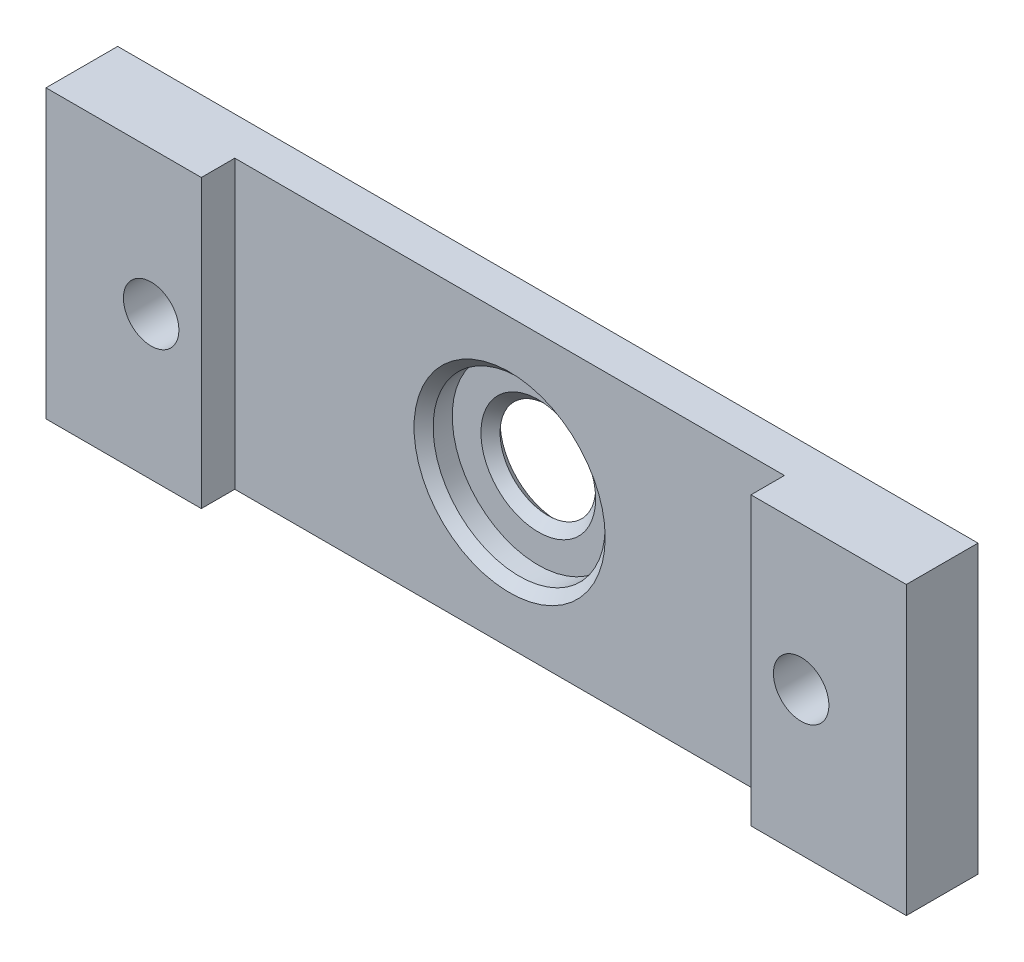
ISO-10303-21;
HEADER;
FILE_DESCRIPTION(('STEP AP214'),'2;1');
FILE_NAME('part.step','',(''),(''),'','','');
FILE_SCHEMA(('AUTOMOTIVE_DESIGN { 1 0 10303 214 1 1 1 1 }'));
ENDSEC;
DATA;
#1=APPLICATION_CONTEXT('core data for automotive mechanical design processes');
#2=APPLICATION_PROTOCOL_DEFINITION('international standard','automotive_design',2000,#1);
#3=PRODUCT_CONTEXT('',#1,'mechanical');
#4=PRODUCT('Part','Part','',(#3));
#5=PRODUCT_RELATED_PRODUCT_CATEGORY('part','',(#4));
#6=PRODUCT_DEFINITION_FORMATION('','',#4);
#7=PRODUCT_DEFINITION_CONTEXT('part definition',#1,'design');
#8=PRODUCT_DEFINITION('design','',#6,#7);
#9=PRODUCT_DEFINITION_SHAPE('','',#8);
#10=(LENGTH_UNIT() NAMED_UNIT(*) SI_UNIT(.MILLI.,.METRE.));
#11=(NAMED_UNIT(*) PLANE_ANGLE_UNIT() SI_UNIT($,.RADIAN.));
#12=(NAMED_UNIT(*) SI_UNIT($,.STERADIAN.) SOLID_ANGLE_UNIT());
#13=UNCERTAINTY_MEASURE_WITH_UNIT(LENGTH_MEASURE(1.E-05),#10,'distance_accuracy_value','');
#14=(GEOMETRIC_REPRESENTATION_CONTEXT(3) GLOBAL_UNCERTAINTY_ASSIGNED_CONTEXT((#13)) GLOBAL_UNIT_ASSIGNED_CONTEXT((#10,
#11,#12)) REPRESENTATION_CONTEXT('',''));
#15=CARTESIAN_POINT('',(0.,0.,0.));
#16=DIRECTION('',(0.,0.,1.));
#17=DIRECTION('',(1.,0.,0.));
#18=AXIS2_PLACEMENT_3D('',#15,#16,#17);
#19=CARTESIAN_POINT('',(-45.,15.,5.));
#20=DIRECTION('',(1.,0.,0.));
#21=DIRECTION('',(0.,1.,0.));
#22=AXIS2_PLACEMENT_3D('',#19,#20,#21);
#23=PLANE('',#22);
#24=DIRECTION('',(0.,0.,-1.));
#25=VECTOR('',#24,1.);
#26=CARTESIAN_POINT('',(-45.,15.,5.));
#27=LINE('',#26,#25);
#28=CARTESIAN_POINT('',(-45.,15.,8.5));
#29=VERTEX_POINT('',#28);
#30=CARTESIAN_POINT('',(-45.,15.,0.999999999999987));
#31=VERTEX_POINT('',#30);
#32=EDGE_CURVE('E135',#29,#31,#27,.T.);
#33=ORIENTED_EDGE('',*,*,#32,.T.);
#34=DIRECTION('',(0.,-1.,0.));
#35=VECTOR('',#34,1.);
#36=CARTESIAN_POINT('',(-45.,15.,0.999999999999987));
#37=LINE('',#36,#35);
#38=CARTESIAN_POINT('',(-45.,-15.,0.999999999999987));
#39=VERTEX_POINT('',#38);
#40=EDGE_CURVE('E213',#31,#39,#37,.T.);
#41=ORIENTED_EDGE('',*,*,#40,.T.);
#42=DIRECTION('',(0.,0.,-1.));
#43=VECTOR('',#42,1.);
#44=CARTESIAN_POINT('',(-45.,-15.,5.));
#45=LINE('',#44,#43);
#46=CARTESIAN_POINT('',(-45.,-15.,8.5));
#47=VERTEX_POINT('',#46);
#48=EDGE_CURVE('E210',#47,#39,#45,.T.);
#49=ORIENTED_EDGE('',*,*,#48,.F.);
#50=DIRECTION('',(0.,-1.,0.));
#51=VECTOR('',#50,1.);
#52=CARTESIAN_POINT('',(-45.,-15.,8.5));
#53=LINE('',#52,#51);
#54=EDGE_CURVE('E187',#29,#47,#53,.T.);
#55=ORIENTED_EDGE('',*,*,#54,.F.);
#56=EDGE_LOOP('',(#33,#41,#49,#55));
#57=FACE_BOUND('',#56,.T.);
#58=ADVANCED_FACE('F47',(#57),#23,.F.);
#59=CARTESIAN_POINT('',(-45.,-15.,5.));
#60=DIRECTION('',(0.,1.,0.));
#61=DIRECTION('',(0.,0.,1.));
#62=AXIS2_PLACEMENT_3D('',#59,#60,#61);
#63=PLANE('',#62);
#64=ORIENTED_EDGE('',*,*,#48,.T.);
#65=DIRECTION('',(1.,0.,0.));
#66=VECTOR('',#65,1.);
#67=CARTESIAN_POINT('',(-45.,-15.,0.999999999999987));
#68=LINE('',#67,#66);
#69=CARTESIAN_POINT('',(45.,-15.,0.999999999999987));
#70=VERTEX_POINT('',#69);
#71=EDGE_CURVE('E65',#39,#70,#68,.T.);
#72=ORIENTED_EDGE('',*,*,#71,.T.);
#73=DIRECTION('',(0.,0.,-1.));
#74=VECTOR('',#73,1.);
#75=CARTESIAN_POINT('',(45.,-15.,5.));
#76=LINE('',#75,#74);
#77=CARTESIAN_POINT('',(45.,-15.,8.5));
#78=VERTEX_POINT('',#77);
#79=EDGE_CURVE('E134',#78,#70,#76,.T.);
#80=ORIENTED_EDGE('',*,*,#79,.F.);
#81=DIRECTION('',(1.,0.,0.));
#82=VECTOR('',#81,1.);
#83=CARTESIAN_POINT('',(45.,-15.,8.5));
#84=LINE('',#83,#82);
#85=CARTESIAN_POINT('',(28.75,-15.,8.5));
#86=VERTEX_POINT('',#85);
#87=EDGE_CURVE('E151',#86,#78,#84,.T.);
#88=ORIENTED_EDGE('',*,*,#87,.F.);
#89=DIRECTION('',(0.,0.,-1.));
#90=VECTOR('',#89,1.);
#91=CARTESIAN_POINT('',(28.75,-15.,8.5));
#92=LINE('',#91,#90);
#93=CARTESIAN_POINT('',(28.75,-15.,5.));
#94=VERTEX_POINT('',#93);
#95=EDGE_CURVE('E166',#86,#94,#92,.T.);
#96=ORIENTED_EDGE('',*,*,#95,.T.);
#97=DIRECTION('',(1.,0.,0.));
#98=VECTOR('',#97,1.);
#99=CARTESIAN_POINT('',(-45.,-15.,5.));
#100=LINE('',#99,#98);
#101=CARTESIAN_POINT('',(-28.75,-15.,5.));
#102=VERTEX_POINT('',#101);
#103=EDGE_CURVE('E173',#102,#94,#100,.T.);
#104=ORIENTED_EDGE('',*,*,#103,.F.);
#105=DIRECTION('',(0.,0.,-1.));
#106=VECTOR('',#105,1.);
#107=CARTESIAN_POINT('',(-28.75,-15.,8.5));
#108=LINE('',#107,#106);
#109=CARTESIAN_POINT('',(-28.75,-15.,8.5));
#110=VERTEX_POINT('',#109);
#111=EDGE_CURVE('E174',#110,#102,#108,.T.);
#112=ORIENTED_EDGE('',*,*,#111,.F.);
#113=DIRECTION('',(1.,0.,0.));
#114=VECTOR('',#113,1.);
#115=CARTESIAN_POINT('',(-45.,-15.,8.5));
#116=LINE('',#115,#114);
#117=EDGE_CURVE('E194',#47,#110,#116,.T.);
#118=ORIENTED_EDGE('',*,*,#117,.F.);
#119=EDGE_LOOP('',(#64,#72,#80,#88,#96,#104,#112,#118));
#120=FACE_BOUND('',#119,.T.);
#121=ADVANCED_FACE('F295',(#120),#63,.F.);
#122=CARTESIAN_POINT('',(45.,15.,5.));
#123=DIRECTION('',(-1.,0.,0.));
#124=DIRECTION('',(0.,-1.,0.));
#125=AXIS2_PLACEMENT_3D('',#122,#123,#124);
#126=PLANE('',#125);
#127=ORIENTED_EDGE('',*,*,#79,.T.);
#128=DIRECTION('',(0.,1.,0.));
#129=VECTOR('',#128,1.);
#130=CARTESIAN_POINT('',(45.,15.,0.999999999999987));
#131=LINE('',#130,#129);
#132=CARTESIAN_POINT('',(45.,15.,0.999999999999987));
#133=VERTEX_POINT('',#132);
#134=EDGE_CURVE('E72',#70,#133,#131,.T.);
#135=ORIENTED_EDGE('',*,*,#134,.T.);
#136=DIRECTION('',(0.,0.,-1.));
#137=VECTOR('',#136,1.);
#138=CARTESIAN_POINT('',(45.,15.,5.));
#139=LINE('',#138,#137);
#140=CARTESIAN_POINT('',(45.,15.,8.5));
#141=VERTEX_POINT('',#140);
#142=EDGE_CURVE('E126',#141,#133,#139,.T.);
#143=ORIENTED_EDGE('',*,*,#142,.F.);
#144=DIRECTION('',(0.,1.,0.));
#145=VECTOR('',#144,1.);
#146=CARTESIAN_POINT('',(45.,-15.,8.5));
#147=LINE('',#146,#145);
#148=EDGE_CURVE('E130',#78,#141,#147,.T.);
#149=ORIENTED_EDGE('',*,*,#148,.F.);
#150=EDGE_LOOP('',(#127,#135,#143,#149));
#151=FACE_BOUND('',#150,.T.);
#152=ADVANCED_FACE('F128',(#151),#126,.F.);
#153=CARTESIAN_POINT('',(-45.,15.,5.));
#154=DIRECTION('',(0.,-1.,0.));
#155=DIRECTION('',(0.,0.,-1.));
#156=AXIS2_PLACEMENT_3D('',#153,#154,#155);
#157=PLANE('',#156);
#158=ORIENTED_EDGE('',*,*,#142,.T.);
#159=DIRECTION('',(-1.,0.,0.));
#160=VECTOR('',#159,1.);
#161=CARTESIAN_POINT('',(-45.,15.,0.999999999999987));
#162=LINE('',#161,#160);
#163=EDGE_CURVE('E238',#133,#31,#162,.T.);
#164=ORIENTED_EDGE('',*,*,#163,.T.);
#165=ORIENTED_EDGE('',*,*,#32,.F.);
#166=DIRECTION('',(-1.,0.,0.));
#167=VECTOR('',#166,1.);
#168=CARTESIAN_POINT('',(-45.,15.,8.5));
#169=LINE('',#168,#167);
#170=CARTESIAN_POINT('',(-28.75,15.,8.5));
#171=VERTEX_POINT('',#170);
#172=EDGE_CURVE('E183',#171,#29,#169,.T.);
#173=ORIENTED_EDGE('',*,*,#172,.F.);
#174=DIRECTION('',(0.,0.,-1.));
#175=VECTOR('',#174,1.);
#176=CARTESIAN_POINT('',(-28.75,15.,8.5));
#177=LINE('',#176,#175);
#178=CARTESIAN_POINT('',(-28.75,15.,5.));
#179=VERTEX_POINT('',#178);
#180=EDGE_CURVE('E178',#171,#179,#177,.T.);
#181=ORIENTED_EDGE('',*,*,#180,.T.);
#182=DIRECTION('',(-1.,0.,0.));
#183=VECTOR('',#182,1.);
#184=CARTESIAN_POINT('',(-45.,15.,5.));
#185=LINE('',#184,#183);
#186=CARTESIAN_POINT('',(28.75,15.,5.));
#187=VERTEX_POINT('',#186);
#188=EDGE_CURVE('E202',#187,#179,#185,.T.);
#189=ORIENTED_EDGE('',*,*,#188,.F.);
#190=DIRECTION('',(0.,0.,-1.));
#191=VECTOR('',#190,1.);
#192=CARTESIAN_POINT('',(28.75,15.,8.5));
#193=LINE('',#192,#191);
#194=CARTESIAN_POINT('',(28.75,15.,8.5));
#195=VERTEX_POINT('',#194);
#196=EDGE_CURVE('E142',#195,#187,#193,.T.);
#197=ORIENTED_EDGE('',*,*,#196,.F.);
#198=DIRECTION('',(-1.,0.,0.));
#199=VECTOR('',#198,1.);
#200=CARTESIAN_POINT('',(45.,15.,8.5));
#201=LINE('',#200,#199);
#202=EDGE_CURVE('E138',#141,#195,#201,.T.);
#203=ORIENTED_EDGE('',*,*,#202,.F.);
#204=EDGE_LOOP('',(#158,#164,#165,#173,#181,#189,#197,#203));
#205=FACE_BOUND('',#204,.T.);
#206=ADVANCED_FACE('F139',(#205),#157,.F.);
#207=CARTESIAN_POINT('',(0.,0.,5.));
#208=DIRECTION('',(0.,0.,1.));
#209=DIRECTION('',(1.,0.,0.));
#210=AXIS2_PLACEMENT_3D('',#207,#208,#209);
#211=PLANE('',#210);
#212=CARTESIAN_POINT('',(0.,0.,5.));
#213=DIRECTION('',(0.,0.,1.));
#214=DIRECTION('',(1.,0.,0.));
#215=AXIS2_PLACEMENT_3D('',#212,#213,#214);
#216=CIRCLE('',#215,9.99999999999999);
#217=CARTESIAN_POINT('',(9.99999999999999,0.,5.));
#218=VERTEX_POINT('',#217);
#219=EDGE_CURVE('E253',#218,#218,#216,.F.);
#220=ORIENTED_EDGE('',*,*,#219,.T.);
#221=EDGE_LOOP('',(#220));
#222=FACE_BOUND('',#221,.T.);
#223=DIRECTION('',(0.,-1.,0.));
#224=VECTOR('',#223,1.);
#225=CARTESIAN_POINT('',(28.75,-15.,5.));
#226=LINE('',#225,#224);
#227=EDGE_CURVE('E153',#187,#94,#226,.T.);
#228=ORIENTED_EDGE('',*,*,#227,.F.);
#229=ORIENTED_EDGE('',*,*,#188,.T.);
#230=DIRECTION('',(0.,1.,0.));
#231=VECTOR('',#230,1.);
#232=CARTESIAN_POINT('',(-28.75,-15.,5.));
#233=LINE('',#232,#231);
#234=EDGE_CURVE('E157',#102,#179,#233,.T.);
#235=ORIENTED_EDGE('',*,*,#234,.F.);
#236=ORIENTED_EDGE('',*,*,#103,.T.);
#237=EDGE_LOOP('',(#228,#229,#235,#236));
#238=FACE_BOUND('',#237,.T.);
#239=ADVANCED_FACE('F365',(#222,#238),#211,.T.);
#240=CARTESIAN_POINT('',(0.,0.,0.));
#241=DIRECTION('',(0.,0.,1.));
#242=DIRECTION('',(1.,0.,0.));
#243=AXIS2_PLACEMENT_3D('',#240,#241,#242);
#244=PLANE('',#243);
#245=CARTESIAN_POINT('',(0.,0.,0.));
#246=DIRECTION('',(0.,0.,1.));
#247=DIRECTION('',(1.,0.,0.));
#248=AXIS2_PLACEMENT_3D('',#245,#246,#247);
#249=CIRCLE('',#248,5.99999999999998);
#250=CARTESIAN_POINT('',(5.99999999999998,0.,0.));
#251=VERTEX_POINT('',#250);
#252=EDGE_CURVE('E58',#251,#251,#249,.T.);
#253=ORIENTED_EDGE('',*,*,#252,.T.);
#254=EDGE_LOOP('',(#253));
#255=FACE_BOUND('',#254,.T.);
#256=DIRECTION('',(-1.,0.,0.));
#257=VECTOR('',#256,1.);
#258=CARTESIAN_POINT('',(0.,-14.,0.));
#259=LINE('',#258,#257);
#260=CARTESIAN_POINT('',(44.,-14.,0.));
#261=VERTEX_POINT('',#260);
#262=CARTESIAN_POINT('',(-44.,-14.,0.));
#263=VERTEX_POINT('',#262);
#264=EDGE_CURVE('E225',#261,#263,#259,.T.);
#265=ORIENTED_EDGE('',*,*,#264,.T.);
#266=DIRECTION('',(0.,1.,0.));
#267=VECTOR('',#266,1.);
#268=CARTESIAN_POINT('',(-44.,0.,0.));
#269=LINE('',#268,#267);
#270=CARTESIAN_POINT('',(-44.,14.,0.));
#271=VERTEX_POINT('',#270);
#272=EDGE_CURVE('E234',#263,#271,#269,.T.);
#273=ORIENTED_EDGE('',*,*,#272,.T.);
#274=DIRECTION('',(1.,0.,0.));
#275=VECTOR('',#274,1.);
#276=CARTESIAN_POINT('',(0.,14.,0.));
#277=LINE('',#276,#275);
#278=CARTESIAN_POINT('',(44.,14.,0.));
#279=VERTEX_POINT('',#278);
#280=EDGE_CURVE('E231',#271,#279,#277,.T.);
#281=ORIENTED_EDGE('',*,*,#280,.T.);
#282=DIRECTION('',(0.,-1.,0.));
#283=VECTOR('',#282,1.);
#284=CARTESIAN_POINT('',(44.,0.,0.));
#285=LINE('',#284,#283);
#286=EDGE_CURVE('E228',#279,#261,#285,.T.);
#287=ORIENTED_EDGE('',*,*,#286,.T.);
#288=EDGE_LOOP('',(#265,#273,#281,#287));
#289=FACE_BOUND('',#288,.T.);
#290=CARTESIAN_POINT('',(34.,0.,0.));
#291=DIRECTION('',(0.,0.,1.));
#292=DIRECTION('',(1.,0.,0.));
#293=AXIS2_PLACEMENT_3D('',#290,#291,#292);
#294=CIRCLE('',#293,3.89999999999999);
#295=CARTESIAN_POINT('',(37.9,0.,0.));
#296=VERTEX_POINT('',#295);
#297=EDGE_CURVE('E221',#296,#296,#294,.T.);
#298=ORIENTED_EDGE('',*,*,#297,.T.);
#299=EDGE_LOOP('',(#298));
#300=FACE_BOUND('',#299,.T.);
#301=CARTESIAN_POINT('',(-34.,0.,0.));
#302=DIRECTION('',(0.,0.,1.));
#303=DIRECTION('',(1.,0.,0.));
#304=AXIS2_PLACEMENT_3D('',#301,#302,#303);
#305=CIRCLE('',#304,3.9);
#306=CARTESIAN_POINT('',(-30.1,0.,0.));
#307=VERTEX_POINT('',#306);
#308=EDGE_CURVE('E217',#307,#307,#305,.T.);
#309=ORIENTED_EDGE('',*,*,#308,.T.);
#310=EDGE_LOOP('',(#309));
#311=FACE_BOUND('',#310,.T.);
#312=ADVANCED_FACE('F280',(#255,#289,#300,#311),#244,.F.);
#313=CARTESIAN_POINT('',(-28.75,-15.,8.5));
#314=DIRECTION('',(-1.,0.,0.));
#315=DIRECTION('',(0.,-1.,0.));
#316=AXIS2_PLACEMENT_3D('',#313,#314,#315);
#317=PLANE('',#316);
#318=ORIENTED_EDGE('',*,*,#234,.T.);
#319=ORIENTED_EDGE('',*,*,#180,.F.);
#320=DIRECTION('',(0.,1.,0.));
#321=VECTOR('',#320,1.);
#322=CARTESIAN_POINT('',(-28.75,-15.,8.5));
#323=LINE('',#322,#321);
#324=EDGE_CURVE('E191',#110,#171,#323,.T.);
#325=ORIENTED_EDGE('',*,*,#324,.F.);
#326=ORIENTED_EDGE('',*,*,#111,.T.);
#327=EDGE_LOOP('',(#318,#319,#325,#326));
#328=FACE_BOUND('',#327,.T.);
#329=ADVANCED_FACE('F392',(#328),#317,.F.);
#330=CARTESIAN_POINT('',(0.,0.,8.5));
#331=DIRECTION('',(0.,0.,-1.));
#332=DIRECTION('',(-1.,0.,0.));
#333=AXIS2_PLACEMENT_3D('',#330,#331,#332);
#334=PLANE('',#333);
#335=CARTESIAN_POINT('',(-34.,0.,8.5));
#336=DIRECTION('',(0.,0.,-1.));
#337=DIRECTION('',(-1.,0.,0.));
#338=AXIS2_PLACEMENT_3D('',#335,#336,#337);
#339=CIRCLE('',#338,2.9);
#340=CARTESIAN_POINT('',(-36.9,0.,8.5));
#341=VERTEX_POINT('',#340);
#342=EDGE_CURVE('E179',#341,#341,#339,.T.);
#343=ORIENTED_EDGE('',*,*,#342,.T.);
#344=EDGE_LOOP('',(#343));
#345=FACE_BOUND('',#344,.T.);
#346=ORIENTED_EDGE('',*,*,#54,.T.);
#347=ORIENTED_EDGE('',*,*,#117,.T.);
#348=ORIENTED_EDGE('',*,*,#324,.T.);
#349=ORIENTED_EDGE('',*,*,#172,.T.);
#350=EDGE_LOOP('',(#346,#347,#348,#349));
#351=FACE_BOUND('',#350,.T.);
#352=ADVANCED_FACE('F388',(#345,#351),#334,.F.);
#353=CARTESIAN_POINT('',(28.75,-15.,8.5));
#354=DIRECTION('',(1.,0.,0.));
#355=DIRECTION('',(0.,1.,0.));
#356=AXIS2_PLACEMENT_3D('',#353,#354,#355);
#357=PLANE('',#356);
#358=ORIENTED_EDGE('',*,*,#227,.T.);
#359=ORIENTED_EDGE('',*,*,#95,.F.);
#360=DIRECTION('',(0.,-1.,0.));
#361=VECTOR('',#360,1.);
#362=CARTESIAN_POINT('',(28.75,-15.,8.5));
#363=LINE('',#362,#361);
#364=EDGE_CURVE('E146',#195,#86,#363,.T.);
#365=ORIENTED_EDGE('',*,*,#364,.F.);
#366=ORIENTED_EDGE('',*,*,#196,.T.);
#367=EDGE_LOOP('',(#358,#359,#365,#366));
#368=FACE_BOUND('',#367,.T.);
#369=ADVANCED_FACE('F374',(#368),#357,.F.);
#370=CARTESIAN_POINT('',(0.,0.,8.5));
#371=DIRECTION('',(0.,0.,1.));
#372=DIRECTION('',(1.,0.,0.));
#373=AXIS2_PLACEMENT_3D('',#370,#371,#372);
#374=PLANE('',#373);
#375=CARTESIAN_POINT('',(34.,0.,8.5));
#376=DIRECTION('',(0.,0.,-1.));
#377=DIRECTION('',(-1.,0.,0.));
#378=AXIS2_PLACEMENT_3D('',#375,#376,#377);
#379=CIRCLE('',#378,2.9);
#380=CARTESIAN_POINT('',(31.1,0.,8.5));
#381=VERTEX_POINT('',#380);
#382=EDGE_CURVE('E160',#381,#381,#379,.T.);
#383=ORIENTED_EDGE('',*,*,#382,.T.);
#384=EDGE_LOOP('',(#383));
#385=FACE_BOUND('',#384,.T.);
#386=ORIENTED_EDGE('',*,*,#148,.T.);
#387=ORIENTED_EDGE('',*,*,#202,.T.);
#388=ORIENTED_EDGE('',*,*,#364,.T.);
#389=ORIENTED_EDGE('',*,*,#87,.T.);
#390=EDGE_LOOP('',(#386,#387,#388,#389));
#391=FACE_BOUND('',#390,.T.);
#392=ADVANCED_FACE('F149',(#385,#391),#374,.T.);
#393=CARTESIAN_POINT('',(34.,0.,8.5));
#394=DIRECTION('',(0.,0.,-1.));
#395=DIRECTION('',(-1.,0.,0.));
#396=AXIS2_PLACEMENT_3D('',#393,#394,#395);
#397=CYLINDRICAL_SURFACE('',#396,2.9);
#398=CARTESIAN_POINT('',(34.,0.,0.99999999999999));
#399=DIRECTION('',(0.,0.,1.));
#400=DIRECTION('',(1.,0.,0.));
#401=AXIS2_PLACEMENT_3D('',#398,#399,#400);
#402=CIRCLE('',#401,2.9);
#403=CARTESIAN_POINT('',(36.9,0.,0.99999999999999));
#404=VERTEX_POINT('',#403);
#405=EDGE_CURVE('E245',#404,#404,#402,.F.);
#406=ORIENTED_EDGE('',*,*,#405,.T.);
#407=EDGE_LOOP('',(#406));
#408=FACE_BOUND('',#407,.T.);
#409=ORIENTED_EDGE('',*,*,#382,.F.);
#410=EDGE_LOOP('',(#409));
#411=FACE_BOUND('',#410,.T.);
#412=ADVANCED_FACE('F420',(#408,#411),#397,.F.);
#413=CARTESIAN_POINT('',(-34.,0.,8.5));
#414=DIRECTION('',(0.,0.,-1.));
#415=DIRECTION('',(-1.,0.,0.));
#416=AXIS2_PLACEMENT_3D('',#413,#414,#415);
#417=CYLINDRICAL_SURFACE('',#416,2.9);
#418=CARTESIAN_POINT('',(-34.,0.,1.00000000000001));
#419=DIRECTION('',(0.,0.,1.));
#420=DIRECTION('',(1.,0.,0.));
#421=AXIS2_PLACEMENT_3D('',#418,#419,#420);
#422=CIRCLE('',#421,2.9);
#423=CARTESIAN_POINT('',(-31.1,0.,1.00000000000001));
#424=VERTEX_POINT('',#423);
#425=EDGE_CURVE('E249',#424,#424,#422,.F.);
#426=ORIENTED_EDGE('',*,*,#425,.T.);
#427=EDGE_LOOP('',(#426));
#428=FACE_BOUND('',#427,.T.);
#429=ORIENTED_EDGE('',*,*,#342,.F.);
#430=EDGE_LOOP('',(#429));
#431=FACE_BOUND('',#430,.T.);
#432=ADVANCED_FACE('F334',(#428,#431),#417,.F.);
#433=CARTESIAN_POINT('',(45.,15.,0.999999999999987));
#434=DIRECTION('',(-0.707106781186546,0.,0.707106781186549));
#435=DIRECTION('',(0.,1.,0.));
#436=AXIS2_PLACEMENT_3D('',#433,#434,#435);
#437=PLANE('',#436);
#438=DIRECTION('',(0.577350269189627,-0.577350269189625,0.577350269189625));
#439=VECTOR('',#438,1.);
#440=CARTESIAN_POINT('',(14.9999999999999,15.,-29.));
#441=LINE('',#440,#439);
#442=EDGE_CURVE('E261',#261,#70,#441,.T.);
#443=ORIENTED_EDGE('',*,*,#442,.F.);
#444=ORIENTED_EDGE('',*,*,#286,.F.);
#445=DIRECTION('',(0.577350269189627,0.577350269189625,0.577350269189625));
#446=VECTOR('',#445,1.);
#447=CARTESIAN_POINT('',(45.,15.,0.999999999999987));
#448=LINE('',#447,#446);
#449=EDGE_CURVE('E265',#133,#279,#448,.F.);
#450=ORIENTED_EDGE('',*,*,#449,.F.);
#451=ORIENTED_EDGE('',*,*,#134,.F.);
#452=EDGE_LOOP('',(#443,#444,#450,#451));
#453=FACE_BOUND('',#452,.T.);
#454=ADVANCED_FACE('F328',(#453),#437,.F.);
#455=CARTESIAN_POINT('',(-45.,15.,0.999999999999987));
#456=DIRECTION('',(0.,-0.707106781186547,0.707106781186547));
#457=DIRECTION('',(-1.,0.,0.));
#458=AXIS2_PLACEMENT_3D('',#455,#456,#457);
#459=PLANE('',#458);
#460=ORIENTED_EDGE('',*,*,#449,.T.);
#461=ORIENTED_EDGE('',*,*,#280,.F.);
#462=DIRECTION('',(-0.577350269189625,0.577350269189626,0.577350269189626));
#463=VECTOR('',#462,1.);
#464=CARTESIAN_POINT('',(-45.,15.,0.999999999999987));
#465=LINE('',#464,#463);
#466=EDGE_CURVE('E257',#31,#271,#465,.F.);
#467=ORIENTED_EDGE('',*,*,#466,.F.);
#468=ORIENTED_EDGE('',*,*,#163,.F.);
#469=EDGE_LOOP('',(#460,#461,#467,#468));
#470=FACE_BOUND('',#469,.T.);
#471=ADVANCED_FACE('F321',(#470),#459,.F.);
#472=CARTESIAN_POINT('',(-45.,-15.,0.999999999999987));
#473=DIRECTION('',(0.,0.707106781186547,0.707106781186547));
#474=DIRECTION('',(1.,0.,0.));
#475=AXIS2_PLACEMENT_3D('',#472,#473,#474);
#476=PLANE('',#475);
#477=ORIENTED_EDGE('',*,*,#442,.T.);
#478=ORIENTED_EDGE('',*,*,#71,.F.);
#479=DIRECTION('',(0.577350269189624,0.577350269189627,-0.577350269189627));
#480=VECTOR('',#479,1.);
#481=CARTESIAN_POINT('',(-45.,-15.,0.999999999999987));
#482=LINE('',#481,#480);
#483=EDGE_CURVE('E254',#263,#39,#482,.F.);
#484=ORIENTED_EDGE('',*,*,#483,.F.);
#485=ORIENTED_EDGE('',*,*,#264,.F.);
#486=EDGE_LOOP('',(#477,#478,#484,#485));
#487=FACE_BOUND('',#486,.T.);
#488=ADVANCED_FACE('F314',(#487),#476,.F.);
#489=CARTESIAN_POINT('',(-45.,15.,0.999999999999987));
#490=DIRECTION('',(0.707106781186549,0.,0.707106781186546));
#491=DIRECTION('',(0.,-1.,0.));
#492=AXIS2_PLACEMENT_3D('',#489,#490,#491);
#493=PLANE('',#492);
#494=ORIENTED_EDGE('',*,*,#466,.T.);
#495=ORIENTED_EDGE('',*,*,#272,.F.);
#496=ORIENTED_EDGE('',*,*,#483,.T.);
#497=ORIENTED_EDGE('',*,*,#40,.F.);
#498=EDGE_LOOP('',(#494,#495,#496,#497));
#499=FACE_BOUND('',#498,.T.);
#500=ADVANCED_FACE('F306',(#499),#493,.F.);
#501=CARTESIAN_POINT('',(34.,0.,0.));
#502=DIRECTION('',(0.,0.,-1.));
#503=DIRECTION('',(-1.,0.,0.));
#504=AXIS2_PLACEMENT_3D('',#501,#502,#503);
#505=CONICAL_SURFACE('',#504,3.89999999999999,0.785398163397447);
#506=ORIENTED_EDGE('',*,*,#405,.F.);
#507=EDGE_LOOP('',(#506));
#508=FACE_BOUND('',#507,.T.);
#509=ORIENTED_EDGE('',*,*,#297,.F.);
#510=EDGE_LOOP('',(#509));
#511=FACE_BOUND('',#510,.T.);
#512=ADVANCED_FACE('F313',(#508,#511),#505,.F.);
#513=CARTESIAN_POINT('',(-34.,0.,0.));
#514=DIRECTION('',(0.,0.,-1.));
#515=DIRECTION('',(-1.,0.,0.));
#516=AXIS2_PLACEMENT_3D('',#513,#514,#515);
#517=CONICAL_SURFACE('',#516,3.9,0.785398163397442);
#518=ORIENTED_EDGE('',*,*,#425,.F.);
#519=EDGE_LOOP('',(#518));
#520=FACE_BOUND('',#519,.T.);
#521=ORIENTED_EDGE('',*,*,#308,.F.);
#522=EDGE_LOOP('',(#521));
#523=FACE_BOUND('',#522,.T.);
#524=ADVANCED_FACE('F341',(#520,#523),#517,.F.);
#525=CARTESIAN_POINT('',(0.,0.,8.5));
#526=DIRECTION('',(0.,0.,-1.));
#527=DIRECTION('',(-1.,0.,0.));
#528=AXIS2_PLACEMENT_3D('',#525,#526,#527);
#529=CYLINDRICAL_SURFACE('',#528,9.);
#530=CARTESIAN_POINT('',(0.,0.,4.00000000000001));
#531=DIRECTION('',(0.,0.,1.));
#532=DIRECTION('',(1.,0.,0.));
#533=AXIS2_PLACEMENT_3D('',#530,#531,#532);
#534=CIRCLE('',#533,9.);
#535=CARTESIAN_POINT('',(9.,0.,4.00000000000001));
#536=VERTEX_POINT('',#535);
#537=EDGE_CURVE('E272',#536,#536,#534,.T.);
#538=ORIENTED_EDGE('',*,*,#537,.T.);
#539=EDGE_LOOP('',(#538));
#540=FACE_BOUND('',#539,.T.);
#541=CARTESIAN_POINT('',(0.,0.,2.));
#542=DIRECTION('',(0.,0.,1.));
#543=DIRECTION('',(1.,0.,0.));
#544=AXIS2_PLACEMENT_3D('',#541,#542,#543);
#545=CIRCLE('',#544,9.);
#546=CARTESIAN_POINT('',(9.,0.,2.));
#547=VERTEX_POINT('',#546);
#548=EDGE_CURVE('E258',#547,#547,#545,.T.);
#549=ORIENTED_EDGE('',*,*,#548,.F.);
#550=EDGE_LOOP('',(#549));
#551=FACE_BOUND('',#550,.T.);
#552=ADVANCED_FACE('F347',(#540,#551),#529,.F.);
#553=CARTESIAN_POINT('',(0.,0.,2.));
#554=DIRECTION('',(0.,0.,1.));
#555=DIRECTION('',(1.,0.,0.));
#556=AXIS2_PLACEMENT_3D('',#553,#554,#555);
#557=PLANE('',#556);
#558=CARTESIAN_POINT('',(0.,0.,2.));
#559=DIRECTION('',(0.,0.,1.));
#560=DIRECTION('',(1.,0.,0.));
#561=AXIS2_PLACEMENT_3D('',#558,#559,#560);
#562=CIRCLE('',#561,5.99999999999999);
#563=CARTESIAN_POINT('',(5.99999999999999,0.,2.));
#564=VERTEX_POINT('',#563);
#565=EDGE_CURVE('E11',#564,#564,#562,.F.);
#566=ORIENTED_EDGE('',*,*,#565,.T.);
#567=EDGE_LOOP('',(#566));
#568=FACE_BOUND('',#567,.T.);
#569=ORIENTED_EDGE('',*,*,#548,.T.);
#570=EDGE_LOOP('',(#569));
#571=FACE_BOUND('',#570,.T.);
#572=ADVANCED_FACE('F352',(#568,#571),#557,.T.);
#573=CARTESIAN_POINT('',(0.,0.,5.));
#574=DIRECTION('',(0.,0.,1.));
#575=DIRECTION('',(1.,0.,0.));
#576=AXIS2_PLACEMENT_3D('',#573,#574,#575);
#577=CONICAL_SURFACE('',#576,9.99999999999999,0.785398163397447);
#578=ORIENTED_EDGE('',*,*,#537,.F.);
#579=EDGE_LOOP('',(#578));
#580=FACE_BOUND('',#579,.T.);
#581=ORIENTED_EDGE('',*,*,#219,.F.);
#582=EDGE_LOOP('',(#581));
#583=FACE_BOUND('',#582,.T.);
#584=ADVANCED_FACE('F289',(#580,#583),#577,.F.);
#585=CARTESIAN_POINT('',(0.,0.,1.00000000000001));
#586=DIRECTION('',(0.,0.,1.));
#587=DIRECTION('',(1.,0.,0.));
#588=AXIS2_PLACEMENT_3D('',#585,#586,#587);
#589=CONICAL_SURFACE('',#588,5.,0.785398163397447);
#590=ORIENTED_EDGE('',*,*,#565,.F.);
#591=EDGE_LOOP('',(#590));
#592=FACE_BOUND('',#591,.T.);
#593=CARTESIAN_POINT('',(0.,0.,1.00000000000001));
#594=DIRECTION('',(0.,0.,1.));
#595=DIRECTION('',(1.,0.,0.));
#596=AXIS2_PLACEMENT_3D('',#593,#594,#595);
#597=CIRCLE('',#596,5.);
#598=CARTESIAN_POINT('',(5.,0.,1.00000000000001));
#599=VERTEX_POINT('',#598);
#600=EDGE_CURVE('E52',#599,#599,#597,.T.);
#601=ORIENTED_EDGE('',*,*,#600,.F.);
#602=EDGE_LOOP('',(#601));
#603=FACE_BOUND('',#602,.T.);
#604=ADVANCED_FACE('F50',(#592,#603),#589,.F.);
#605=CARTESIAN_POINT('',(0.,0.,0.));
#606=DIRECTION('',(0.,0.,-1.));
#607=DIRECTION('',(-1.,0.,0.));
#608=AXIS2_PLACEMENT_3D('',#605,#606,#607);
#609=CONICAL_SURFACE('',#608,5.99999999999998,0.785398163397447);
#610=ORIENTED_EDGE('',*,*,#600,.T.);
#611=EDGE_LOOP('',(#610));
#612=FACE_BOUND('',#611,.T.);
#613=ORIENTED_EDGE('',*,*,#252,.F.);
#614=EDGE_LOOP('',(#613));
#615=FACE_BOUND('',#614,.T.);
#616=ADVANCED_FACE('F283',(#612,#615),#609,.F.);
#617=CLOSED_SHELL('',(#58,#121,#152,#206,#239,#312,#329,#352,#369,#392,#412,#432,#454,#471,#488,
#500,#512,#524,#552,#572,#584,#604,#616));
#618=MANIFOLD_SOLID_BREP('B2',#617);
#619=ADVANCED_BREP_SHAPE_REPRESENTATION('',(#18,#618),#14);
#620=SHAPE_DEFINITION_REPRESENTATION(#9,#619);
ENDSEC;
END-ISO-10303-21;
